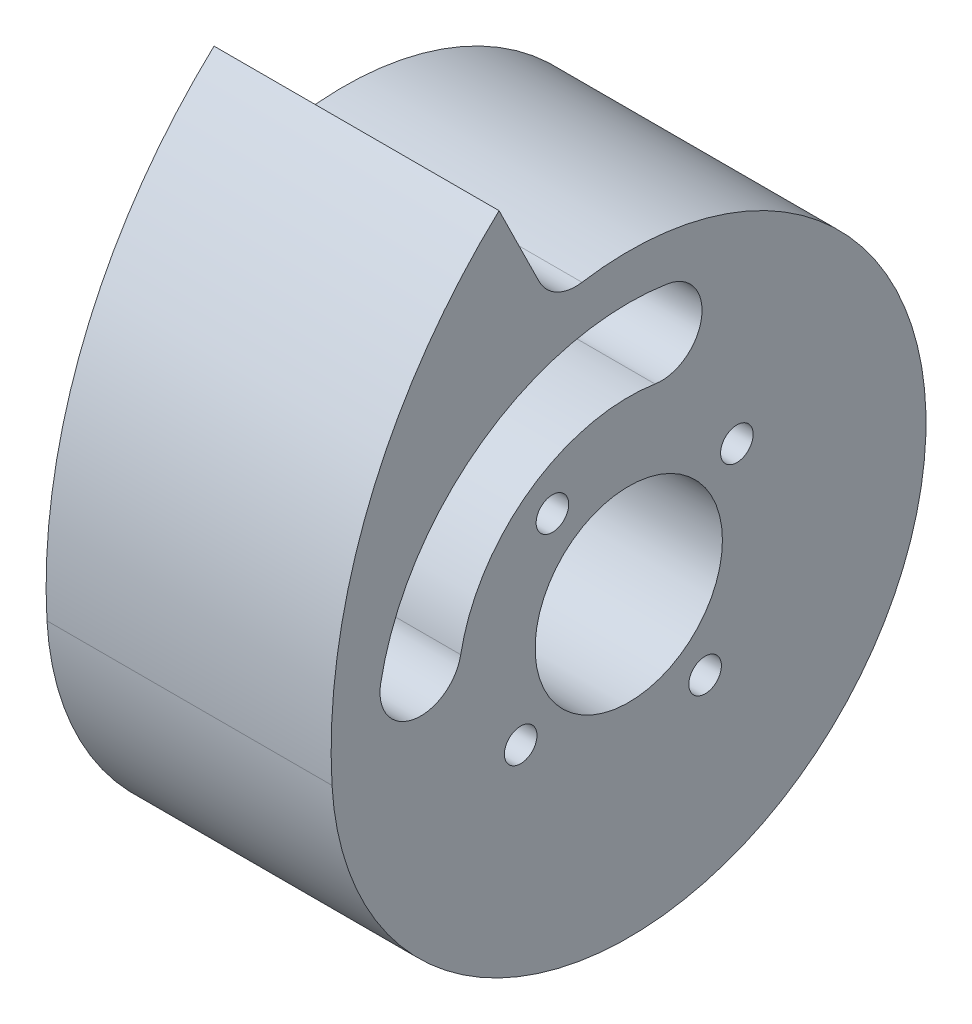
ISO-10303-21;
HEADER;
FILE_DESCRIPTION(('STEP AP214'),'2;1');
FILE_NAME('part.step','',(''),(''),'','','');
FILE_SCHEMA(('AUTOMOTIVE_DESIGN { 1 0 10303 214 1 1 1 1 }'));
ENDSEC;
DATA;
#1=APPLICATION_CONTEXT('core data for automotive mechanical design processes');
#2=APPLICATION_PROTOCOL_DEFINITION('international standard','automotive_design',2000,#1);
#3=PRODUCT_CONTEXT('',#1,'mechanical');
#4=PRODUCT('Part','Part','',(#3));
#5=PRODUCT_RELATED_PRODUCT_CATEGORY('part','',(#4));
#6=PRODUCT_DEFINITION_FORMATION('','',#4);
#7=PRODUCT_DEFINITION_CONTEXT('part definition',#1,'design');
#8=PRODUCT_DEFINITION('design','',#6,#7);
#9=PRODUCT_DEFINITION_SHAPE('','',#8);
#10=(LENGTH_UNIT() NAMED_UNIT(*) SI_UNIT(.MILLI.,.METRE.));
#11=(NAMED_UNIT(*) PLANE_ANGLE_UNIT() SI_UNIT($,.RADIAN.));
#12=(NAMED_UNIT(*) SI_UNIT($,.STERADIAN.) SOLID_ANGLE_UNIT());
#13=UNCERTAINTY_MEASURE_WITH_UNIT(LENGTH_MEASURE(1.E-05),#10,'distance_accuracy_value','');
#14=(GEOMETRIC_REPRESENTATION_CONTEXT(3) GLOBAL_UNCERTAINTY_ASSIGNED_CONTEXT((#13)) GLOBAL_UNIT_ASSIGNED_CONTEXT((#10,
#11,#12)) REPRESENTATION_CONTEXT('',''));
#15=CARTESIAN_POINT('',(0.,0.,0.));
#16=DIRECTION('',(0.,0.,1.));
#17=DIRECTION('',(1.,0.,0.));
#18=AXIS2_PLACEMENT_3D('',#15,#16,#17);
#19=CARTESIAN_POINT('',(17.5,4.82416550917286,25.5485308215582));
#20=DIRECTION('',(-1.,0.,0.));
#21=DIRECTION('',(0.,0.,1.));
#22=AXIS2_PLACEMENT_3D('',#19,#20,#21);
#23=CYLINDRICAL_SURFACE('',#22,5.);
#24=CARTESIAN_POINT('',(-17.5,4.82416550917286,25.5485308215582));
#25=DIRECTION('',(1.,0.,0.));
#26=DIRECTION('',(0.,0.,-1.));
#27=AXIS2_PLACEMENT_3D('',#24,#25,#26);
#28=CIRCLE('',#27,5.);
#29=CARTESIAN_POINT('',(-17.5,5.75188964555225,30.4617098257039));
#30=VERTEX_POINT('',#29);
#31=CARTESIAN_POINT('',(-17.5,3.89644137279346,20.6353518174124));
#32=VERTEX_POINT('',#31);
#33=EDGE_CURVE('E158',#30,#32,#28,.T.);
#34=ORIENTED_EDGE('',*,*,#33,.F.);
#35=DIRECTION('',(-1.,0.,0.));
#36=VECTOR('',#35,1.);
#37=CARTESIAN_POINT('',(17.5,5.75188964555225,30.4617098257039));
#38=LINE('',#37,#36);
#39=CARTESIAN_POINT('',(17.5,5.75188964555225,30.4617098257039));
#40=VERTEX_POINT('',#39);
#41=EDGE_CURVE('E174',#40,#30,#38,.T.);
#42=ORIENTED_EDGE('',*,*,#41,.F.);
#43=CARTESIAN_POINT('',(17.5,4.82416550917286,25.5485308215582));
#44=DIRECTION('',(1.,0.,0.));
#45=DIRECTION('',(0.,0.,-1.));
#46=AXIS2_PLACEMENT_3D('',#43,#44,#45);
#47=CIRCLE('',#46,5.);
#48=CARTESIAN_POINT('',(17.5,3.89644137279346,20.6353518174124));
#49=VERTEX_POINT('',#48);
#50=EDGE_CURVE('E138',#40,#49,#47,.T.);
#51=ORIENTED_EDGE('',*,*,#50,.T.);
#52=DIRECTION('',(-1.,0.,0.));
#53=VECTOR('',#52,1.);
#54=CARTESIAN_POINT('',(17.5,3.89644137279346,20.6353518174124));
#55=LINE('',#54,#53);
#56=EDGE_CURVE('E115',#49,#32,#55,.T.);
#57=ORIENTED_EDGE('',*,*,#56,.T.);
#58=EDGE_LOOP('',(#34,#42,#51,#57));
#59=FACE_BOUND('',#58,.T.);
#60=ADVANCED_FACE('F40',(#59),#23,.F.);
#61=CARTESIAN_POINT('',(17.5,0.,0.));
#62=DIRECTION('',(-1.,0.,0.));
#63=DIRECTION('',(0.,0.,1.));
#64=AXIS2_PLACEMENT_3D('',#61,#62,#63);
#65=CYLINDRICAL_SURFACE('',#64,31.);
#66=CARTESIAN_POINT('',(-17.5,0.,0.));
#67=DIRECTION('',(1.,0.,0.));
#68=DIRECTION('',(0.,0.,-1.));
#69=AXIS2_PLACEMENT_3D('',#66,#67,#68);
#70=CIRCLE('',#69,31.);
#71=CARTESIAN_POINT('',(-17.5,30.6317404939887,-4.76408168579528));
#72=VERTEX_POINT('',#71);
#73=EDGE_CURVE('E161',#72,#30,#70,.T.);
#74=ORIENTED_EDGE('',*,*,#73,.F.);
#75=DIRECTION('',(-1.,0.,0.));
#76=VECTOR('',#75,1.);
#77=CARTESIAN_POINT('',(17.5,30.6317404939887,-4.76408168579528));
#78=LINE('',#77,#76);
#79=CARTESIAN_POINT('',(17.5,30.6317404939887,-4.76408168579528));
#80=VERTEX_POINT('',#79);
#81=EDGE_CURVE('E172',#80,#72,#78,.T.);
#82=ORIENTED_EDGE('',*,*,#81,.F.);
#83=CARTESIAN_POINT('',(17.5,0.,0.));
#84=DIRECTION('',(1.,0.,0.));
#85=DIRECTION('',(0.,0.,-1.));
#86=AXIS2_PLACEMENT_3D('',#83,#84,#85);
#87=CIRCLE('',#86,31.);
#88=EDGE_CURVE('E141',#80,#40,#87,.T.);
#89=ORIENTED_EDGE('',*,*,#88,.T.);
#90=ORIENTED_EDGE('',*,*,#41,.T.);
#91=EDGE_LOOP('',(#74,#82,#89,#90));
#92=FACE_BOUND('',#91,.T.);
#93=ADVANCED_FACE('F194',(#92),#65,.F.);
#94=CARTESIAN_POINT('',(17.5,25.6911371885067,-3.99568141389281));
#95=DIRECTION('',(-1.,0.,0.));
#96=DIRECTION('',(0.,0.,1.));
#97=AXIS2_PLACEMENT_3D('',#94,#95,#96);
#98=CYLINDRICAL_SURFACE('',#97,4.99999999999999);
#99=CARTESIAN_POINT('',(-17.5,25.6911371885067,-3.99568141389281));
#100=DIRECTION('',(1.,0.,0.));
#101=DIRECTION('',(0.,0.,-1.));
#102=AXIS2_PLACEMENT_3D('',#99,#100,#101);
#103=CIRCLE('',#102,4.99999999999999);
#104=CARTESIAN_POINT('',(-17.5,20.7505338830246,-3.22728114199035));
#105=VERTEX_POINT('',#104);
#106=EDGE_CURVE('E164',#105,#72,#103,.T.);
#107=ORIENTED_EDGE('',*,*,#106,.F.);
#108=DIRECTION('',(-1.,0.,0.));
#109=VECTOR('',#108,1.);
#110=CARTESIAN_POINT('',(17.5,20.7505338830246,-3.22728114199035));
#111=LINE('',#110,#109);
#112=CARTESIAN_POINT('',(17.5,20.7505338830246,-3.22728114199035));
#113=VERTEX_POINT('',#112);
#114=EDGE_CURVE('E170',#113,#105,#111,.T.);
#115=ORIENTED_EDGE('',*,*,#114,.F.);
#116=CARTESIAN_POINT('',(17.5,25.6911371885067,-3.99568141389281));
#117=DIRECTION('',(1.,0.,0.));
#118=DIRECTION('',(0.,0.,-1.));
#119=AXIS2_PLACEMENT_3D('',#116,#117,#118);
#120=CIRCLE('',#119,4.99999999999999);
#121=EDGE_CURVE('E144',#113,#80,#120,.T.);
#122=ORIENTED_EDGE('',*,*,#121,.T.);
#123=ORIENTED_EDGE('',*,*,#81,.T.);
#124=EDGE_LOOP('',(#107,#115,#122,#123));
#125=FACE_BOUND('',#124,.T.);
#126=ADVANCED_FACE('F200',(#125),#98,.F.);
#127=CARTESIAN_POINT('',(17.5,3.19502787997991,-6.49329885542743));
#128=DIRECTION('',(0.,0.441497924889228,-0.897262270642483));
#129=DIRECTION('',(0.,0.897262270642483,0.441497924889228));
#130=AXIS2_PLACEMENT_3D('',#127,#128,#129);
#131=PLANE('',#130);
#132=DIRECTION('',(0.,-0.897262270642484,-0.441497924889228));
#133=VECTOR('',#132,1.);
#134=CARTESIAN_POINT('',(17.5,3.19502787997991,-6.49329885542743));
#135=LINE('',#134,#133);
#136=CARTESIAN_POINT('',(17.5,48.753873832299,15.9239325454808));
#137=VERTEX_POINT('',#136);
#138=CARTESIAN_POINT('',(17.5,38.7758720284031,11.0142564840917));
#139=VERTEX_POINT('',#138);
#140=EDGE_CURVE('E110',#137,#139,#135,.T.);
#141=ORIENTED_EDGE('',*,*,#140,.T.);
#142=DIRECTION('',(-1.,0.,0.));
#143=VECTOR('',#142,1.);
#144=CARTESIAN_POINT('',(17.5,38.775872028403,11.0142564840917));
#145=LINE('',#144,#143);
#146=CARTESIAN_POINT('',(-17.5,38.7758720284031,11.0142564840917));
#147=VERTEX_POINT('',#146);
#148=EDGE_CURVE('E176',#139,#147,#145,.T.);
#149=ORIENTED_EDGE('',*,*,#148,.T.);
#150=DIRECTION('',(0.,-0.897262270642484,-0.441497924889228));
#151=VECTOR('',#150,1.);
#152=CARTESIAN_POINT('',(-17.5,3.19502787997991,-6.49329885542743));
#153=LINE('',#152,#151);
#154=CARTESIAN_POINT('',(-17.5,48.753873832299,15.9239325454808));
#155=VERTEX_POINT('',#154);
#156=EDGE_CURVE('E112',#155,#147,#153,.T.);
#157=ORIENTED_EDGE('',*,*,#156,.F.);
#158=DIRECTION('',(-1.,0.,0.));
#159=VECTOR('',#158,1.);
#160=CARTESIAN_POINT('',(17.5,48.753873832299,15.9239325454808));
#161=LINE('',#160,#159);
#162=EDGE_CURVE('E105',#137,#155,#161,.T.);
#163=ORIENTED_EDGE('',*,*,#162,.F.);
#164=EDGE_LOOP('',(#141,#149,#157,#163));
#165=FACE_BOUND('',#164,.T.);
#166=ADVANCED_FACE('F107',(#165),#131,.T.);
#167=CARTESIAN_POINT('',(17.5,1.59709841696109,-27.6819639428142));
#168=DIRECTION('',(-1.,0.,0.));
#169=DIRECTION('',(0.,0.,1.));
#170=AXIS2_PLACEMENT_3D('',#167,#168,#169);
#171=CYLINDRICAL_SURFACE('',#170,64.2279976032299);
#172=CARTESIAN_POINT('',(-17.5,1.59709841696109,-27.6819639428142));
#173=DIRECTION('',(1.,0.,0.));
#174=DIRECTION('',(0.,0.,-1.));
#175=AXIS2_PLACEMENT_3D('',#172,#173,#174);
#176=CIRCLE('',#175,64.2279976032299);
#177=CARTESIAN_POINT('',(-17.5,-2.10235492130485,36.4394031754756));
#178=VERTEX_POINT('',#177);
#179=EDGE_CURVE('E153',#155,#178,#176,.T.);
#180=ORIENTED_EDGE('',*,*,#179,.T.);
#181=DIRECTION('',(-1.,0.,0.));
#182=VECTOR('',#181,1.);
#183=CARTESIAN_POINT('',(17.5,-2.10235492130485,36.4394031754756));
#184=LINE('',#183,#182);
#185=CARTESIAN_POINT('',(17.5,-2.10235492130485,36.4394031754756));
#186=VERTEX_POINT('',#185);
#187=EDGE_CURVE('E116',#186,#178,#184,.T.);
#188=ORIENTED_EDGE('',*,*,#187,.F.);
#189=CARTESIAN_POINT('',(17.5,1.59709841696109,-27.6819639428142));
#190=DIRECTION('',(1.,0.,0.));
#191=DIRECTION('',(0.,0.,-1.));
#192=AXIS2_PLACEMENT_3D('',#189,#190,#191);
#193=CIRCLE('',#192,64.2279976032299);
#194=EDGE_CURVE('E119',#137,#186,#193,.T.);
#195=ORIENTED_EDGE('',*,*,#194,.F.);
#196=ORIENTED_EDGE('',*,*,#162,.T.);
#197=EDGE_LOOP('',(#180,#188,#195,#196));
#198=FACE_BOUND('',#197,.T.);
#199=ADVANCED_FACE('F120',(#198),#171,.T.);
#200=CARTESIAN_POINT('',(17.5,0.,0.));
#201=DIRECTION('',(-1.,0.,0.));
#202=DIRECTION('',(0.,0.,1.));
#203=AXIS2_PLACEMENT_3D('',#200,#201,#202);
#204=CYLINDRICAL_SURFACE('',#203,21.);
#205=CARTESIAN_POINT('',(-17.5,0.,0.));
#206=DIRECTION('',(1.,0.,0.));
#207=DIRECTION('',(0.,0.,-1.));
#208=AXIS2_PLACEMENT_3D('',#205,#206,#207);
#209=CIRCLE('',#208,21.);
#210=EDGE_CURVE('E131',#105,#32,#209,.T.);
#211=ORIENTED_EDGE('',*,*,#210,.T.);
#212=ORIENTED_EDGE('',*,*,#56,.F.);
#213=CARTESIAN_POINT('',(17.5,0.,0.));
#214=DIRECTION('',(1.,0.,0.));
#215=DIRECTION('',(0.,0.,-1.));
#216=AXIS2_PLACEMENT_3D('',#213,#214,#215);
#217=CIRCLE('',#216,21.);
#218=EDGE_CURVE('E147',#113,#49,#217,.T.);
#219=ORIENTED_EDGE('',*,*,#218,.F.);
#220=ORIENTED_EDGE('',*,*,#114,.T.);
#221=EDGE_LOOP('',(#211,#212,#219,#220));
#222=FACE_BOUND('',#221,.T.);
#223=ADVANCED_FACE('F209',(#222),#204,.T.);
#224=CARTESIAN_POINT('',(17.5,0.,0.));
#225=DIRECTION('',(-1.,0.,0.));
#226=DIRECTION('',(0.,0.,1.));
#227=AXIS2_PLACEMENT_3D('',#224,#225,#226);
#228=CYLINDRICAL_SURFACE('',#227,36.5);
#229=CARTESIAN_POINT('',(-17.5,0.,0.));
#230=DIRECTION('',(1.,0.,0.));
#231=DIRECTION('',(0.,0.,-1.));
#232=AXIS2_PLACEMENT_3D('',#229,#230,#231);
#233=CIRCLE('',#232,36.5);
#234=CARTESIAN_POINT('',(-17.5,36.0456072368433,5.74144571752032));
#235=VERTEX_POINT('',#234);
#236=EDGE_CURVE('E156',#178,#235,#233,.T.);
#237=ORIENTED_EDGE('',*,*,#236,.T.);
#238=DIRECTION('',(-1.,0.,0.));
#239=VECTOR('',#238,1.);
#240=CARTESIAN_POINT('',(17.5,36.0456072368433,5.74144571752032));
#241=LINE('',#240,#239);
#242=CARTESIAN_POINT('',(17.5,36.0456072368433,5.74144571752032));
#243=VERTEX_POINT('',#242);
#244=EDGE_CURVE('E55',#235,#243,#241,.F.);
#245=ORIENTED_EDGE('',*,*,#244,.T.);
#246=CARTESIAN_POINT('',(17.5,0.,0.));
#247=DIRECTION('',(1.,0.,0.));
#248=DIRECTION('',(0.,0.,-1.));
#249=AXIS2_PLACEMENT_3D('',#246,#247,#248);
#250=CIRCLE('',#249,36.5);
#251=EDGE_CURVE('E123',#186,#243,#250,.T.);
#252=ORIENTED_EDGE('',*,*,#251,.F.);
#253=ORIENTED_EDGE('',*,*,#187,.T.);
#254=EDGE_LOOP('',(#237,#245,#252,#253));
#255=FACE_BOUND('',#254,.T.);
#256=ADVANCED_FACE('F182',(#255),#228,.T.);
#257=CARTESIAN_POINT('',(17.5,0.,0.));
#258=DIRECTION('',(-1.,0.,0.));
#259=DIRECTION('',(0.,0.,1.));
#260=AXIS2_PLACEMENT_3D('',#257,#258,#259);
#261=CYLINDRICAL_SURFACE('',#260,11.5);
#262=CARTESIAN_POINT('',(17.5,0.,0.));
#263=DIRECTION('',(1.,0.,0.));
#264=DIRECTION('',(0.,0.,-1.));
#265=AXIS2_PLACEMENT_3D('',#262,#263,#264);
#266=CIRCLE('',#265,11.5);
#267=CARTESIAN_POINT('',(17.5,0.,-11.5));
#268=VERTEX_POINT('',#267);
#269=EDGE_CURVE('E149',#268,#268,#266,.T.);
#270=ORIENTED_EDGE('',*,*,#269,.T.);
#271=EDGE_LOOP('',(#270));
#272=FACE_BOUND('',#271,.T.);
#273=CARTESIAN_POINT('',(-17.5,0.,0.));
#274=DIRECTION('',(1.,0.,0.));
#275=DIRECTION('',(0.,0.,-1.));
#276=AXIS2_PLACEMENT_3D('',#273,#274,#275);
#277=CIRCLE('',#276,11.5);
#278=CARTESIAN_POINT('',(-17.5,0.,-11.5));
#279=VERTEX_POINT('',#278);
#280=EDGE_CURVE('E128',#279,#279,#277,.T.);
#281=ORIENTED_EDGE('',*,*,#280,.F.);
#282=EDGE_LOOP('',(#281));
#283=FACE_BOUND('',#282,.T.);
#284=ADVANCED_FACE('F208',(#272,#283),#261,.F.);
#285=CARTESIAN_POINT('',(17.5,0.,0.));
#286=DIRECTION('',(1.,0.,0.));
#287=DIRECTION('',(0.,0.,-1.));
#288=AXIS2_PLACEMENT_3D('',#285,#286,#287);
#289=PLANE('',#288);
#290=CARTESIAN_POINT('',(17.5,-13.2731378731058,-9.37476991725799));
#291=DIRECTION('',(1.,0.,0.));
#292=DIRECTION('',(0.,0.,-1.));
#293=AXIS2_PLACEMENT_3D('',#290,#291,#292);
#294=CIRCLE('',#293,2.);
#295=CARTESIAN_POINT('',(17.5,-13.2731378731058,-11.374769917258));
#296=VERTEX_POINT('',#295);
#297=EDGE_CURVE('E261',#296,#296,#294,.T.);
#298=ORIENTED_EDGE('',*,*,#297,.F.);
#299=EDGE_LOOP('',(#298));
#300=FACE_BOUND('',#299,.T.);
#301=CARTESIAN_POINT('',(17.5,9.37476991725799,-13.2731378731058));
#302=DIRECTION('',(1.,0.,0.));
#303=DIRECTION('',(0.,0.,-1.));
#304=AXIS2_PLACEMENT_3D('',#301,#302,#303);
#305=CIRCLE('',#304,2.);
#306=CARTESIAN_POINT('',(17.5,9.37476991725799,-15.2731378731058));
#307=VERTEX_POINT('',#306);
#308=EDGE_CURVE('E260',#307,#307,#305,.T.);
#309=ORIENTED_EDGE('',*,*,#308,.F.);
#310=EDGE_LOOP('',(#309));
#311=FACE_BOUND('',#310,.T.);
#312=CARTESIAN_POINT('',(17.5,-9.37476991725799,13.2731378731058));
#313=DIRECTION('',(1.,0.,0.));
#314=DIRECTION('',(0.,0.,-1.));
#315=AXIS2_PLACEMENT_3D('',#312,#313,#314);
#316=CIRCLE('',#315,2.);
#317=CARTESIAN_POINT('',(17.5,-9.37476991725799,11.2731378731058));
#318=VERTEX_POINT('',#317);
#319=EDGE_CURVE('E270',#318,#318,#316,.T.);
#320=ORIENTED_EDGE('',*,*,#319,.F.);
#321=EDGE_LOOP('',(#320));
#322=FACE_BOUND('',#321,.T.);
#323=CARTESIAN_POINT('',(17.5,13.2731378731058,9.37476991725799));
#324=DIRECTION('',(1.,0.,0.));
#325=DIRECTION('',(0.,0.,-1.));
#326=AXIS2_PLACEMENT_3D('',#323,#324,#325);
#327=CIRCLE('',#326,2.);
#328=CARTESIAN_POINT('',(17.5,13.2731378731058,7.37476991725799));
#329=VERTEX_POINT('',#328);
#330=EDGE_CURVE('E134',#329,#329,#327,.T.);
#331=ORIENTED_EDGE('',*,*,#330,.F.);
#332=EDGE_LOOP('',(#331));
#333=FACE_BOUND('',#332,.T.);
#334=ORIENTED_EDGE('',*,*,#140,.F.);
#335=ORIENTED_EDGE('',*,*,#194,.T.);
#336=ORIENTED_EDGE('',*,*,#251,.T.);
#337=CARTESIAN_POINT('',(17.5,40.9833616528492,6.52794513087927));
#338=DIRECTION('',(1.,0.,0.));
#339=DIRECTION('',(0.,0.,-1.));
#340=AXIS2_PLACEMENT_3D('',#337,#338,#339);
#341=CIRCLE('',#340,5.);
#342=EDGE_CURVE('E11',#243,#139,#341,.F.);
#343=ORIENTED_EDGE('',*,*,#342,.T.);
#344=EDGE_LOOP('',(#334,#335,#336,#343));
#345=FACE_BOUND('',#344,.T.);
#346=ORIENTED_EDGE('',*,*,#50,.F.);
#347=ORIENTED_EDGE('',*,*,#88,.F.);
#348=ORIENTED_EDGE('',*,*,#121,.F.);
#349=ORIENTED_EDGE('',*,*,#218,.T.);
#350=EDGE_LOOP('',(#346,#347,#348,#349));
#351=FACE_BOUND('',#350,.T.);
#352=ORIENTED_EDGE('',*,*,#269,.F.);
#353=EDGE_LOOP('',(#352));
#354=FACE_BOUND('',#353,.T.);
#355=ADVANCED_FACE('F125',(#300,#311,#322,#333,#345,#351,#354),#289,.T.);
#356=CARTESIAN_POINT('',(-17.5,0.,0.));
#357=DIRECTION('',(1.,0.,0.));
#358=DIRECTION('',(0.,0.,-1.));
#359=AXIS2_PLACEMENT_3D('',#356,#357,#358);
#360=PLANE('',#359);
#361=ORIENTED_EDGE('',*,*,#156,.T.);
#362=CARTESIAN_POINT('',(-17.5,40.9833616528492,6.52794513087927));
#363=DIRECTION('',(1.,0.,0.));
#364=DIRECTION('',(0.,0.,-1.));
#365=AXIS2_PLACEMENT_3D('',#362,#363,#364);
#366=CIRCLE('',#365,5.);
#367=EDGE_CURVE('E48',#147,#235,#366,.T.);
#368=ORIENTED_EDGE('',*,*,#367,.T.);
#369=ORIENTED_EDGE('',*,*,#236,.F.);
#370=ORIENTED_EDGE('',*,*,#179,.F.);
#371=EDGE_LOOP('',(#361,#368,#369,#370));
#372=FACE_BOUND('',#371,.T.);
#373=ORIENTED_EDGE('',*,*,#33,.T.);
#374=ORIENTED_EDGE('',*,*,#210,.F.);
#375=ORIENTED_EDGE('',*,*,#106,.T.);
#376=ORIENTED_EDGE('',*,*,#73,.T.);
#377=EDGE_LOOP('',(#373,#374,#375,#376));
#378=FACE_BOUND('',#377,.T.);
#379=ORIENTED_EDGE('',*,*,#280,.T.);
#380=EDGE_LOOP('',(#379));
#381=FACE_BOUND('',#380,.T.);
#382=ADVANCED_FACE('F180',(#372,#378,#381),#360,.F.);
#383=CARTESIAN_POINT('',(17.5,40.9833616528492,6.52794513087927));
#384=DIRECTION('',(-1.,0.,0.));
#385=DIRECTION('',(0.,0.,1.));
#386=AXIS2_PLACEMENT_3D('',#383,#384,#385);
#387=CYLINDRICAL_SURFACE('',#386,5.);
#388=ORIENTED_EDGE('',*,*,#342,.F.);
#389=ORIENTED_EDGE('',*,*,#244,.F.);
#390=ORIENTED_EDGE('',*,*,#367,.F.);
#391=ORIENTED_EDGE('',*,*,#148,.F.);
#392=EDGE_LOOP('',(#388,#389,#390,#391));
#393=FACE_BOUND('',#392,.T.);
#394=ADVANCED_FACE('F42',(#393),#387,.F.);
#395=CARTESIAN_POINT('',(7.5,13.2731378731058,9.37476991725799));
#396=DIRECTION('',(1.,0.,0.));
#397=DIRECTION('',(0.,0.,-1.));
#398=AXIS2_PLACEMENT_3D('',#395,#396,#397);
#399=CYLINDRICAL_SURFACE('',#398,2.);
#400=CARTESIAN_POINT('',(7.5,13.2731378731058,9.37476991725799));
#401=DIRECTION('',(1.,0.,0.));
#402=DIRECTION('',(0.,0.,-1.));
#403=AXIS2_PLACEMENT_3D('',#400,#401,#402);
#404=CIRCLE('',#403,2.);
#405=CARTESIAN_POINT('',(7.5,13.2731378731058,7.37476991725799));
#406=VERTEX_POINT('',#405);
#407=EDGE_CURVE('E154',#406,#406,#404,.T.);
#408=ORIENTED_EDGE('',*,*,#407,.F.);
#409=EDGE_LOOP('',(#408));
#410=FACE_BOUND('',#409,.T.);
#411=ORIENTED_EDGE('',*,*,#330,.T.);
#412=EDGE_LOOP('',(#411));
#413=FACE_BOUND('',#412,.T.);
#414=ADVANCED_FACE('F184',(#410,#413),#399,.F.);
#415=CARTESIAN_POINT('',(7.5,13.2731378731058,9.37476991725799));
#416=DIRECTION('',(1.,0.,0.));
#417=DIRECTION('',(0.,0.,-1.));
#418=AXIS2_PLACEMENT_3D('',#415,#416,#417);
#419=PLANE('',#418);
#420=ORIENTED_EDGE('',*,*,#407,.T.);
#421=EDGE_LOOP('',(#420));
#422=FACE_BOUND('',#421,.T.);
#423=ADVANCED_FACE('F189',(#422),#419,.T.);
#424=CARTESIAN_POINT('',(7.5,-9.37476991725799,13.2731378731058));
#425=DIRECTION('',(1.,0.,0.));
#426=DIRECTION('',(0.,0.,-1.));
#427=AXIS2_PLACEMENT_3D('',#424,#425,#426);
#428=CYLINDRICAL_SURFACE('',#427,2.);
#429=CARTESIAN_POINT('',(7.5,-9.37476991725799,13.2731378731058));
#430=DIRECTION('',(1.,0.,0.));
#431=DIRECTION('',(0.,0.,-1.));
#432=AXIS2_PLACEMENT_3D('',#429,#430,#431);
#433=CIRCLE('',#432,2.);
#434=CARTESIAN_POINT('',(7.5,-9.37476991725799,11.2731378731058));
#435=VERTEX_POINT('',#434);
#436=EDGE_CURVE('E272',#435,#435,#433,.T.);
#437=ORIENTED_EDGE('',*,*,#436,.F.);
#438=EDGE_LOOP('',(#437));
#439=FACE_BOUND('',#438,.T.);
#440=ORIENTED_EDGE('',*,*,#319,.T.);
#441=EDGE_LOOP('',(#440));
#442=FACE_BOUND('',#441,.T.);
#443=ADVANCED_FACE('F231',(#439,#442),#428,.F.);
#444=CARTESIAN_POINT('',(7.5,-9.37476991725799,13.2731378731058));
#445=DIRECTION('',(1.,0.,0.));
#446=DIRECTION('',(0.,0.,-1.));
#447=AXIS2_PLACEMENT_3D('',#444,#445,#446);
#448=PLANE('',#447);
#449=ORIENTED_EDGE('',*,*,#436,.T.);
#450=EDGE_LOOP('',(#449));
#451=FACE_BOUND('',#450,.T.);
#452=ADVANCED_FACE('F235',(#451),#448,.T.);
#453=CARTESIAN_POINT('',(7.5,9.37476991725799,-13.2731378731058));
#454=DIRECTION('',(1.,0.,0.));
#455=DIRECTION('',(0.,0.,-1.));
#456=AXIS2_PLACEMENT_3D('',#453,#454,#455);
#457=CYLINDRICAL_SURFACE('',#456,2.);
#458=CARTESIAN_POINT('',(7.5,9.37476991725799,-13.2731378731058));
#459=DIRECTION('',(1.,0.,0.));
#460=DIRECTION('',(0.,0.,-1.));
#461=AXIS2_PLACEMENT_3D('',#458,#459,#460);
#462=CIRCLE('',#461,2.);
#463=CARTESIAN_POINT('',(7.5,9.37476991725799,-15.2731378731058));
#464=VERTEX_POINT('',#463);
#465=EDGE_CURVE('E264',#464,#464,#462,.T.);
#466=ORIENTED_EDGE('',*,*,#465,.F.);
#467=EDGE_LOOP('',(#466));
#468=FACE_BOUND('',#467,.T.);
#469=ORIENTED_EDGE('',*,*,#308,.T.);
#470=EDGE_LOOP('',(#469));
#471=FACE_BOUND('',#470,.T.);
#472=ADVANCED_FACE('F239',(#468,#471),#457,.F.);
#473=CARTESIAN_POINT('',(7.5,9.37476991725799,-13.2731378731058));
#474=DIRECTION('',(1.,0.,0.));
#475=DIRECTION('',(0.,0.,-1.));
#476=AXIS2_PLACEMENT_3D('',#473,#474,#475);
#477=PLANE('',#476);
#478=ORIENTED_EDGE('',*,*,#465,.T.);
#479=EDGE_LOOP('',(#478));
#480=FACE_BOUND('',#479,.T.);
#481=ADVANCED_FACE('F243',(#480),#477,.T.);
#482=CARTESIAN_POINT('',(7.5,-13.2731378731058,-9.37476991725799));
#483=DIRECTION('',(1.,0.,0.));
#484=DIRECTION('',(0.,0.,-1.));
#485=AXIS2_PLACEMENT_3D('',#482,#483,#484);
#486=CYLINDRICAL_SURFACE('',#485,2.);
#487=CARTESIAN_POINT('',(7.5,-13.2731378731058,-9.37476991725799));
#488=DIRECTION('',(1.,0.,0.));
#489=DIRECTION('',(0.,0.,-1.));
#490=AXIS2_PLACEMENT_3D('',#487,#488,#489);
#491=CIRCLE('',#490,2.);
#492=CARTESIAN_POINT('',(7.5,-13.2731378731058,-11.374769917258));
#493=VERTEX_POINT('',#492);
#494=EDGE_CURVE('E259',#493,#493,#491,.T.);
#495=ORIENTED_EDGE('',*,*,#494,.F.);
#496=EDGE_LOOP('',(#495));
#497=FACE_BOUND('',#496,.T.);
#498=ORIENTED_EDGE('',*,*,#297,.T.);
#499=EDGE_LOOP('',(#498));
#500=FACE_BOUND('',#499,.T.);
#501=ADVANCED_FACE('F247',(#497,#500),#486,.F.);
#502=CARTESIAN_POINT('',(7.5,-13.2731378731058,-9.37476991725799));
#503=DIRECTION('',(1.,0.,0.));
#504=DIRECTION('',(0.,0.,-1.));
#505=AXIS2_PLACEMENT_3D('',#502,#503,#504);
#506=PLANE('',#505);
#507=ORIENTED_EDGE('',*,*,#494,.T.);
#508=EDGE_LOOP('',(#507));
#509=FACE_BOUND('',#508,.T.);
#510=ADVANCED_FACE('F251',(#509),#506,.T.);
#511=CLOSED_SHELL('',(#60,#93,#126,#166,#199,#223,#256,#284,#355,#382,#394,#414,#423,#443,#452,
#472,#481,#501,#510));
#512=MANIFOLD_SOLID_BREP('B2',#511);
#513=ADVANCED_BREP_SHAPE_REPRESENTATION('',(#18,#512),#14);
#514=SHAPE_DEFINITION_REPRESENTATION(#9,#513);
ENDSEC;
END-ISO-10303-21;
